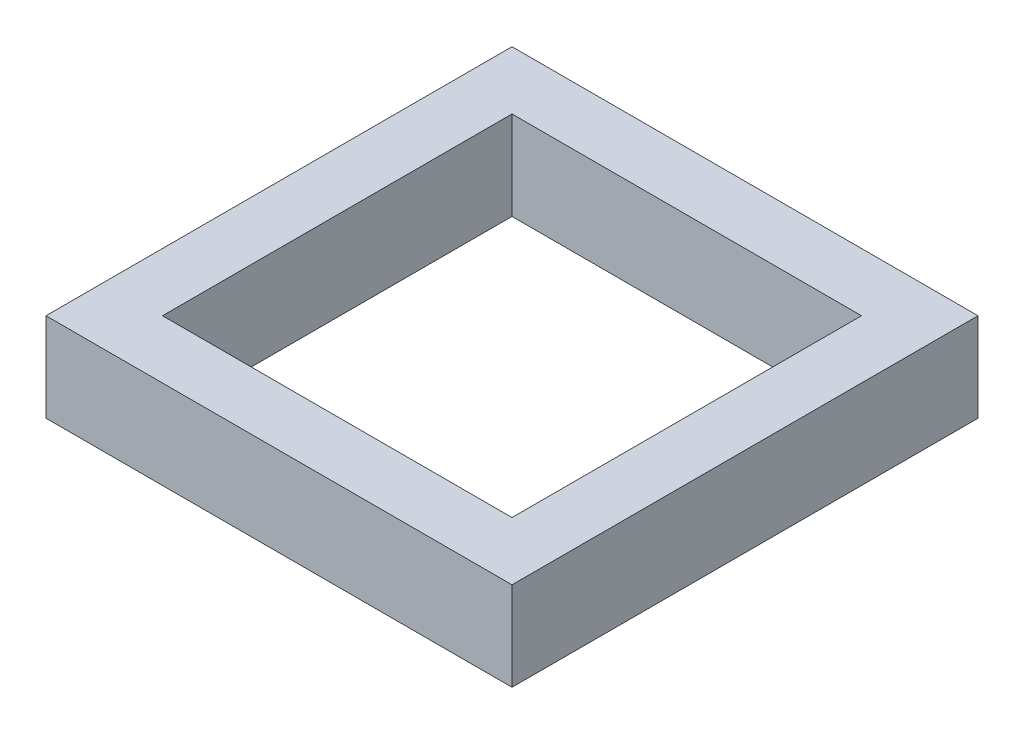
ISO-10303-21;
HEADER;
FILE_DESCRIPTION(('STEP AP214'),'2;1');
FILE_NAME('part.step','',(''),(''),'','','');
FILE_SCHEMA(('AUTOMOTIVE_DESIGN { 1 0 10303 214 1 1 1 1 }'));
ENDSEC;
DATA;
#1=APPLICATION_CONTEXT('core data for automotive mechanical design processes');
#2=APPLICATION_PROTOCOL_DEFINITION('international standard','automotive_design',2000,#1);
#3=PRODUCT_CONTEXT('',#1,'mechanical');
#4=PRODUCT('Part','Part','',(#3));
#5=PRODUCT_RELATED_PRODUCT_CATEGORY('part','',(#4));
#6=PRODUCT_DEFINITION_FORMATION('','',#4);
#7=PRODUCT_DEFINITION_CONTEXT('part definition',#1,'design');
#8=PRODUCT_DEFINITION('design','',#6,#7);
#9=PRODUCT_DEFINITION_SHAPE('','',#8);
#10=(LENGTH_UNIT() NAMED_UNIT(*) SI_UNIT(.MILLI.,.METRE.));
#11=(NAMED_UNIT(*) PLANE_ANGLE_UNIT() SI_UNIT($,.RADIAN.));
#12=(NAMED_UNIT(*) SI_UNIT($,.STERADIAN.) SOLID_ANGLE_UNIT());
#13=UNCERTAINTY_MEASURE_WITH_UNIT(LENGTH_MEASURE(1.E-05),#10,'distance_accuracy_value','');
#14=(GEOMETRIC_REPRESENTATION_CONTEXT(3) GLOBAL_UNCERTAINTY_ASSIGNED_CONTEXT((#13)) GLOBAL_UNIT_ASSIGNED_CONTEXT((#10,
#11,#12)) REPRESENTATION_CONTEXT('',''));
#15=CARTESIAN_POINT('',(0.,0.,0.));
#16=DIRECTION('',(0.,0.,1.));
#17=DIRECTION('',(1.,0.,0.));
#18=AXIS2_PLACEMENT_3D('',#15,#16,#17);
#19=CARTESIAN_POINT('',(0.,5.08,0.));
#20=DIRECTION('',(0.,1.,0.));
#21=DIRECTION('',(0.,0.,1.));
#22=AXIS2_PLACEMENT_3D('',#19,#20,#21);
#23=PLANE('',#22);
#24=DIRECTION('',(0.,0.,1.));
#25=VECTOR('',#24,1.);
#26=CARTESIAN_POINT('',(-10.340874015748,5.08,-11.088905511811));
#27=LINE('',#26,#25);
#28=CARTESIAN_POINT('',(-10.340874015748,5.08,-11.088905511811));
#29=VERTEX_POINT('',#28);
#30=CARTESIAN_POINT('',(-10.340874015748,5.08,15.577094488189));
#31=VERTEX_POINT('',#30);
#32=EDGE_CURVE('E134',#29,#31,#27,.T.);
#33=ORIENTED_EDGE('',*,*,#32,.T.);
#34=DIRECTION('',(1.,0.,0.));
#35=VECTOR('',#34,1.);
#36=CARTESIAN_POINT('',(-10.340874015748,5.08,15.577094488189));
#37=LINE('',#36,#35);
#38=CARTESIAN_POINT('',(16.325125984252,5.08,15.577094488189));
#39=VERTEX_POINT('',#38);
#40=EDGE_CURVE('E137',#31,#39,#37,.T.);
#41=ORIENTED_EDGE('',*,*,#40,.T.);
#42=DIRECTION('',(0.,0.,-1.));
#43=VECTOR('',#42,1.);
#44=CARTESIAN_POINT('',(16.325125984252,5.08,-11.088905511811));
#45=LINE('',#44,#43);
#46=CARTESIAN_POINT('',(16.325125984252,5.08,-11.088905511811));
#47=VERTEX_POINT('',#46);
#48=EDGE_CURVE('E140',#39,#47,#45,.T.);
#49=ORIENTED_EDGE('',*,*,#48,.T.);
#50=DIRECTION('',(-1.,0.,0.));
#51=VECTOR('',#50,1.);
#52=CARTESIAN_POINT('',(-10.340874015748,5.08,-11.088905511811));
#53=LINE('',#52,#51);
#54=EDGE_CURVE('E142',#47,#29,#53,.T.);
#55=ORIENTED_EDGE('',*,*,#54,.T.);
#56=EDGE_LOOP('',(#33,#41,#49,#55));
#57=FACE_BOUND('',#56,.T.);
#58=DIRECTION('',(1.,0.,0.));
#59=VECTOR('',#58,1.);
#60=CARTESIAN_POINT('',(-7.00787401574803,5.08,12.244094488189));
#61=LINE('',#60,#59);
#62=CARTESIAN_POINT('',(-7.00787401574803,5.08,12.244094488189));
#63=VERTEX_POINT('',#62);
#64=CARTESIAN_POINT('',(12.992125984252,5.08,12.244094488189));
#65=VERTEX_POINT('',#64);
#66=EDGE_CURVE('E106',#63,#65,#61,.T.);
#67=ORIENTED_EDGE('',*,*,#66,.F.);
#68=DIRECTION('',(0.,0.,1.));
#69=VECTOR('',#68,1.);
#70=CARTESIAN_POINT('',(-7.00787401574803,5.08,-7.75590551181103));
#71=LINE('',#70,#69);
#72=CARTESIAN_POINT('',(-7.00787401574803,5.08,-7.75590551181103));
#73=VERTEX_POINT('',#72);
#74=EDGE_CURVE('E98',#73,#63,#71,.T.);
#75=ORIENTED_EDGE('',*,*,#74,.F.);
#76=DIRECTION('',(-1.,0.,0.));
#77=VECTOR('',#76,1.);
#78=CARTESIAN_POINT('',(-7.00787401574803,5.08,-7.75590551181103));
#79=LINE('',#78,#77);
#80=CARTESIAN_POINT('',(12.992125984252,5.08,-7.75590551181103));
#81=VERTEX_POINT('',#80);
#82=EDGE_CURVE('E120',#81,#73,#79,.T.);
#83=ORIENTED_EDGE('',*,*,#82,.F.);
#84=DIRECTION('',(0.,0.,-1.));
#85=VECTOR('',#84,1.);
#86=CARTESIAN_POINT('',(12.992125984252,5.08,-7.75590551181103));
#87=LINE('',#86,#85);
#88=EDGE_CURVE('E118',#65,#81,#87,.T.);
#89=ORIENTED_EDGE('',*,*,#88,.F.);
#90=EDGE_LOOP('',(#67,#75,#83,#89));
#91=FACE_BOUND('',#90,.T.);
#92=ADVANCED_FACE('F33',(#57,#91),#23,.T.);
#93=CARTESIAN_POINT('',(0.,0.,0.));
#94=DIRECTION('',(0.,1.,0.));
#95=DIRECTION('',(0.,0.,1.));
#96=AXIS2_PLACEMENT_3D('',#93,#94,#95);
#97=PLANE('',#96);
#98=DIRECTION('',(0.,0.,1.));
#99=VECTOR('',#98,1.);
#100=CARTESIAN_POINT('',(-10.340874015748,0.,-11.088905511811));
#101=LINE('',#100,#99);
#102=CARTESIAN_POINT('',(-10.340874015748,0.,-11.088905511811));
#103=VERTEX_POINT('',#102);
#104=CARTESIAN_POINT('',(-10.340874015748,0.,15.577094488189));
#105=VERTEX_POINT('',#104);
#106=EDGE_CURVE('E114',#103,#105,#101,.T.);
#107=ORIENTED_EDGE('',*,*,#106,.F.);
#108=DIRECTION('',(-1.,0.,0.));
#109=VECTOR('',#108,1.);
#110=CARTESIAN_POINT('',(-10.340874015748,0.,-11.088905511811));
#111=LINE('',#110,#109);
#112=CARTESIAN_POINT('',(16.325125984252,0.,-11.088905511811));
#113=VERTEX_POINT('',#112);
#114=EDGE_CURVE('E138',#113,#103,#111,.T.);
#115=ORIENTED_EDGE('',*,*,#114,.F.);
#116=DIRECTION('',(0.,0.,-1.));
#117=VECTOR('',#116,1.);
#118=CARTESIAN_POINT('',(16.325125984252,0.,-11.088905511811));
#119=LINE('',#118,#117);
#120=CARTESIAN_POINT('',(16.325125984252,0.,15.577094488189));
#121=VERTEX_POINT('',#120);
#122=EDGE_CURVE('E149',#121,#113,#119,.T.);
#123=ORIENTED_EDGE('',*,*,#122,.F.);
#124=DIRECTION('',(1.,0.,0.));
#125=VECTOR('',#124,1.);
#126=CARTESIAN_POINT('',(-10.340874015748,0.,15.577094488189));
#127=LINE('',#126,#125);
#128=EDGE_CURVE('E147',#105,#121,#127,.T.);
#129=ORIENTED_EDGE('',*,*,#128,.F.);
#130=EDGE_LOOP('',(#107,#115,#123,#129));
#131=FACE_BOUND('',#130,.T.);
#132=DIRECTION('',(0.,0.,1.));
#133=VECTOR('',#132,1.);
#134=CARTESIAN_POINT('',(-7.00787401574803,0.,-7.75590551181103));
#135=LINE('',#134,#133);
#136=CARTESIAN_POINT('',(-7.00787401574803,0.,-7.75590551181103));
#137=VERTEX_POINT('',#136);
#138=CARTESIAN_POINT('',(-7.00787401574803,0.,12.244094488189));
#139=VERTEX_POINT('',#138);
#140=EDGE_CURVE('E56',#137,#139,#135,.T.);
#141=ORIENTED_EDGE('',*,*,#140,.T.);
#142=DIRECTION('',(1.,0.,0.));
#143=VECTOR('',#142,1.);
#144=CARTESIAN_POINT('',(-7.00787401574803,0.,12.244094488189));
#145=LINE('',#144,#143);
#146=CARTESIAN_POINT('',(12.992125984252,0.,12.244094488189));
#147=VERTEX_POINT('',#146);
#148=EDGE_CURVE('E113',#139,#147,#145,.T.);
#149=ORIENTED_EDGE('',*,*,#148,.T.);
#150=DIRECTION('',(0.,0.,-1.));
#151=VECTOR('',#150,1.);
#152=CARTESIAN_POINT('',(12.992125984252,0.,-7.75590551181103));
#153=LINE('',#152,#151);
#154=CARTESIAN_POINT('',(12.992125984252,0.,-7.75590551181103));
#155=VERTEX_POINT('',#154);
#156=EDGE_CURVE('E126',#147,#155,#153,.T.);
#157=ORIENTED_EDGE('',*,*,#156,.T.);
#158=DIRECTION('',(-1.,0.,0.));
#159=VECTOR('',#158,1.);
#160=CARTESIAN_POINT('',(-7.00787401574803,0.,-7.75590551181103));
#161=LINE('',#160,#159);
#162=EDGE_CURVE('E107',#155,#137,#161,.T.);
#163=ORIENTED_EDGE('',*,*,#162,.T.);
#164=EDGE_LOOP('',(#141,#149,#157,#163));
#165=FACE_BOUND('',#164,.T.);
#166=ADVANCED_FACE('F167',(#131,#165),#97,.F.);
#167=CARTESIAN_POINT('',(-10.340874015748,5.08,-11.088905511811));
#168=DIRECTION('',(1.,0.,0.));
#169=DIRECTION('',(0.,0.,-1.));
#170=AXIS2_PLACEMENT_3D('',#167,#168,#169);
#171=PLANE('',#170);
#172=ORIENTED_EDGE('',*,*,#106,.T.);
#173=DIRECTION('',(0.,-1.,0.));
#174=VECTOR('',#173,1.);
#175=CARTESIAN_POINT('',(-10.340874015748,5.08,15.577094488189));
#176=LINE('',#175,#174);
#177=EDGE_CURVE('E11',#31,#105,#176,.T.);
#178=ORIENTED_EDGE('',*,*,#177,.F.);
#179=ORIENTED_EDGE('',*,*,#32,.F.);
#180=DIRECTION('',(0.,-1.,0.));
#181=VECTOR('',#180,1.);
#182=CARTESIAN_POINT('',(-10.340874015748,5.08,-11.088905511811));
#183=LINE('',#182,#181);
#184=EDGE_CURVE('E144',#29,#103,#183,.T.);
#185=ORIENTED_EDGE('',*,*,#184,.T.);
#186=EDGE_LOOP('',(#172,#178,#179,#185));
#187=FACE_BOUND('',#186,.T.);
#188=ADVANCED_FACE('F35',(#187),#171,.F.);
#189=CARTESIAN_POINT('',(-10.340874015748,5.08,15.577094488189));
#190=DIRECTION('',(0.,0.,-1.));
#191=DIRECTION('',(-1.,0.,0.));
#192=AXIS2_PLACEMENT_3D('',#189,#190,#191);
#193=PLANE('',#192);
#194=ORIENTED_EDGE('',*,*,#128,.T.);
#195=DIRECTION('',(0.,-1.,0.));
#196=VECTOR('',#195,1.);
#197=CARTESIAN_POINT('',(16.325125984252,5.08,15.577094488189));
#198=LINE('',#197,#196);
#199=EDGE_CURVE('E41',#39,#121,#198,.T.);
#200=ORIENTED_EDGE('',*,*,#199,.F.);
#201=ORIENTED_EDGE('',*,*,#40,.F.);
#202=ORIENTED_EDGE('',*,*,#177,.T.);
#203=EDGE_LOOP('',(#194,#200,#201,#202));
#204=FACE_BOUND('',#203,.T.);
#205=ADVANCED_FACE('F177',(#204),#193,.F.);
#206=CARTESIAN_POINT('',(16.325125984252,5.08,-11.088905511811));
#207=DIRECTION('',(-1.,0.,0.));
#208=DIRECTION('',(0.,0.,1.));
#209=AXIS2_PLACEMENT_3D('',#206,#207,#208);
#210=PLANE('',#209);
#211=ORIENTED_EDGE('',*,*,#122,.T.);
#212=DIRECTION('',(0.,-1.,0.));
#213=VECTOR('',#212,1.);
#214=CARTESIAN_POINT('',(16.325125984252,5.08,-11.088905511811));
#215=LINE('',#214,#213);
#216=EDGE_CURVE('E154',#47,#113,#215,.T.);
#217=ORIENTED_EDGE('',*,*,#216,.F.);
#218=ORIENTED_EDGE('',*,*,#48,.F.);
#219=ORIENTED_EDGE('',*,*,#199,.T.);
#220=EDGE_LOOP('',(#211,#217,#218,#219));
#221=FACE_BOUND('',#220,.T.);
#222=ADVANCED_FACE('F161',(#221),#210,.F.);
#223=CARTESIAN_POINT('',(-10.340874015748,5.08,-11.088905511811));
#224=DIRECTION('',(0.,0.,1.));
#225=DIRECTION('',(1.,0.,0.));
#226=AXIS2_PLACEMENT_3D('',#223,#224,#225);
#227=PLANE('',#226);
#228=ORIENTED_EDGE('',*,*,#114,.T.);
#229=ORIENTED_EDGE('',*,*,#184,.F.);
#230=ORIENTED_EDGE('',*,*,#54,.F.);
#231=ORIENTED_EDGE('',*,*,#216,.T.);
#232=EDGE_LOOP('',(#228,#229,#230,#231));
#233=FACE_BOUND('',#232,.T.);
#234=ADVANCED_FACE('F171',(#233),#227,.F.);
#235=CARTESIAN_POINT('',(-7.00787401574803,5.08,-7.75590551181103));
#236=DIRECTION('',(1.,0.,0.));
#237=DIRECTION('',(0.,0.,-1.));
#238=AXIS2_PLACEMENT_3D('',#235,#236,#237);
#239=PLANE('',#238);
#240=ORIENTED_EDGE('',*,*,#140,.F.);
#241=DIRECTION('',(0.,-1.,0.));
#242=VECTOR('',#241,1.);
#243=CARTESIAN_POINT('',(-7.00787401574803,5.08,-7.75590551181103));
#244=LINE('',#243,#242);
#245=EDGE_CURVE('E102',#73,#137,#244,.T.);
#246=ORIENTED_EDGE('',*,*,#245,.F.);
#247=ORIENTED_EDGE('',*,*,#74,.T.);
#248=DIRECTION('',(0.,-1.,0.));
#249=VECTOR('',#248,1.);
#250=CARTESIAN_POINT('',(-7.00787401574803,5.08,12.244094488189));
#251=LINE('',#250,#249);
#252=EDGE_CURVE('E101',#63,#139,#251,.T.);
#253=ORIENTED_EDGE('',*,*,#252,.T.);
#254=EDGE_LOOP('',(#240,#246,#247,#253));
#255=FACE_BOUND('',#254,.T.);
#256=ADVANCED_FACE('F100',(#255),#239,.T.);
#257=CARTESIAN_POINT('',(-7.00787401574803,5.08,12.244094488189));
#258=DIRECTION('',(0.,0.,-1.));
#259=DIRECTION('',(-1.,0.,0.));
#260=AXIS2_PLACEMENT_3D('',#257,#258,#259);
#261=PLANE('',#260);
#262=ORIENTED_EDGE('',*,*,#148,.F.);
#263=ORIENTED_EDGE('',*,*,#252,.F.);
#264=ORIENTED_EDGE('',*,*,#66,.T.);
#265=DIRECTION('',(0.,-1.,0.));
#266=VECTOR('',#265,1.);
#267=CARTESIAN_POINT('',(12.992125984252,5.08,12.244094488189));
#268=LINE('',#267,#266);
#269=EDGE_CURVE('E115',#65,#147,#268,.T.);
#270=ORIENTED_EDGE('',*,*,#269,.T.);
#271=EDGE_LOOP('',(#262,#263,#264,#270));
#272=FACE_BOUND('',#271,.T.);
#273=ADVANCED_FACE('F110',(#272),#261,.T.);
#274=CARTESIAN_POINT('',(12.992125984252,5.08,-7.75590551181103));
#275=DIRECTION('',(-1.,0.,0.));
#276=DIRECTION('',(0.,0.,1.));
#277=AXIS2_PLACEMENT_3D('',#274,#275,#276);
#278=PLANE('',#277);
#279=ORIENTED_EDGE('',*,*,#156,.F.);
#280=ORIENTED_EDGE('',*,*,#269,.F.);
#281=ORIENTED_EDGE('',*,*,#88,.T.);
#282=DIRECTION('',(0.,-1.,0.));
#283=VECTOR('',#282,1.);
#284=CARTESIAN_POINT('',(12.992125984252,5.08,-7.75590551181103));
#285=LINE('',#284,#283);
#286=EDGE_CURVE('E48',#81,#155,#285,.T.);
#287=ORIENTED_EDGE('',*,*,#286,.T.);
#288=EDGE_LOOP('',(#279,#280,#281,#287));
#289=FACE_BOUND('',#288,.T.);
#290=ADVANCED_FACE('F200',(#289),#278,.T.);
#291=CARTESIAN_POINT('',(-7.00787401574803,5.08,-7.75590551181103));
#292=DIRECTION('',(0.,0.,1.));
#293=DIRECTION('',(1.,0.,0.));
#294=AXIS2_PLACEMENT_3D('',#291,#292,#293);
#295=PLANE('',#294);
#296=ORIENTED_EDGE('',*,*,#162,.F.);
#297=ORIENTED_EDGE('',*,*,#286,.F.);
#298=ORIENTED_EDGE('',*,*,#82,.T.);
#299=ORIENTED_EDGE('',*,*,#245,.T.);
#300=EDGE_LOOP('',(#296,#297,#298,#299));
#301=FACE_BOUND('',#300,.T.);
#302=ADVANCED_FACE('F204',(#301),#295,.T.);
#303=CLOSED_SHELL('',(#92,#166,#188,#205,#222,#234,#256,#273,#290,#302));
#304=MANIFOLD_SOLID_BREP('B2',#303);
#305=ADVANCED_BREP_SHAPE_REPRESENTATION('',(#18,#304),#14);
#306=SHAPE_DEFINITION_REPRESENTATION(#9,#305);
ENDSEC;
END-ISO-10303-21;
